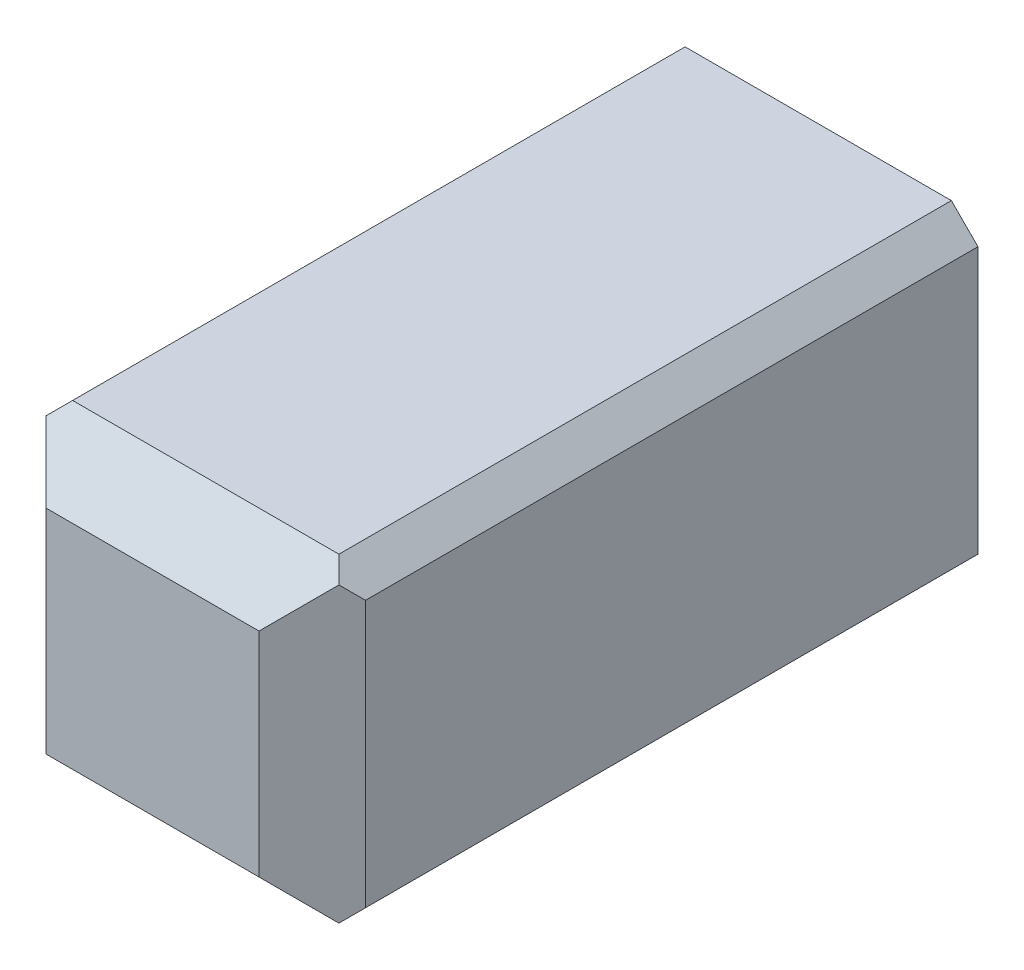
ISO-10303-21;
HEADER;
FILE_DESCRIPTION(('STEP AP214'),'2;1');
FILE_NAME('part.step','',(''),(''),'','','');
FILE_SCHEMA(('AUTOMOTIVE_DESIGN { 1 0 10303 214 1 1 1 1 }'));
ENDSEC;
DATA;
#1=APPLICATION_CONTEXT('core data for automotive mechanical design processes');
#2=APPLICATION_PROTOCOL_DEFINITION('international standard','automotive_design',2000,#1);
#3=PRODUCT_CONTEXT('',#1,'mechanical');
#4=PRODUCT('Part','Part','',(#3));
#5=PRODUCT_RELATED_PRODUCT_CATEGORY('part','',(#4));
#6=PRODUCT_DEFINITION_FORMATION('','',#4);
#7=PRODUCT_DEFINITION_CONTEXT('part definition',#1,'design');
#8=PRODUCT_DEFINITION('design','',#6,#7);
#9=PRODUCT_DEFINITION_SHAPE('','',#8);
#10=(LENGTH_UNIT() NAMED_UNIT(*) SI_UNIT(.MILLI.,.METRE.));
#11=(NAMED_UNIT(*) PLANE_ANGLE_UNIT() SI_UNIT($,.RADIAN.));
#12=(NAMED_UNIT(*) SI_UNIT($,.STERADIAN.) SOLID_ANGLE_UNIT());
#13=UNCERTAINTY_MEASURE_WITH_UNIT(LENGTH_MEASURE(1.E-05),#10,'distance_accuracy_value','');
#14=(GEOMETRIC_REPRESENTATION_CONTEXT(3) GLOBAL_UNCERTAINTY_ASSIGNED_CONTEXT((#13)) GLOBAL_UNIT_ASSIGNED_CONTEXT((#10,
#11,#12)) REPRESENTATION_CONTEXT('',''));
#15=CARTESIAN_POINT('',(0.,0.,0.));
#16=DIRECTION('',(0.,0.,1.));
#17=DIRECTION('',(1.,0.,0.));
#18=AXIS2_PLACEMENT_3D('',#15,#16,#17);
#19=CARTESIAN_POINT('',(0.,0.,50.));
#20=DIRECTION('',(1.,0.,0.));
#21=DIRECTION('',(0.,0.,-1.));
#22=AXIS2_PLACEMENT_3D('',#19,#20,#21);
#23=PLANE('',#22);
#24=DIRECTION('',(0.,0.,1.));
#25=VECTOR('',#24,1.);
#26=CARTESIAN_POINT('',(0.,2.,50.));
#27=LINE('',#26,#25);
#28=CARTESIAN_POINT('',(0.,2.,0.));
#29=VERTEX_POINT('',#28);
#30=CARTESIAN_POINT('',(0.,2.,46.));
#31=VERTEX_POINT('',#30);
#32=EDGE_CURVE('E140',#29,#31,#27,.T.);
#33=ORIENTED_EDGE('',*,*,#32,.T.);
#34=DIRECTION('',(0.,1.,0.));
#35=VECTOR('',#34,1.);
#36=CARTESIAN_POINT('',(0.,0.,46.));
#37=LINE('',#36,#35);
#38=CARTESIAN_POINT('',(0.,22.,46.));
#39=VERTEX_POINT('',#38);
#40=EDGE_CURVE('E11',#31,#39,#37,.T.);
#41=ORIENTED_EDGE('',*,*,#40,.T.);
#42=DIRECTION('',(0.,0.,-1.));
#43=VECTOR('',#42,1.);
#44=CARTESIAN_POINT('',(0.,22.,50.));
#45=LINE('',#44,#43);
#46=CARTESIAN_POINT('',(0.,22.,0.));
#47=VERTEX_POINT('',#46);
#48=EDGE_CURVE('E144',#39,#47,#45,.T.);
#49=ORIENTED_EDGE('',*,*,#48,.T.);
#50=DIRECTION('',(0.,-1.,0.));
#51=VECTOR('',#50,1.);
#52=CARTESIAN_POINT('',(0.,0.,0.));
#53=LINE('',#52,#51);
#54=EDGE_CURVE('E151',#47,#29,#53,.T.);
#55=ORIENTED_EDGE('',*,*,#54,.T.);
#56=EDGE_LOOP('',(#33,#41,#49,#55));
#57=FACE_BOUND('',#56,.T.);
#58=ADVANCED_FACE('F33',(#57),#23,.F.);
#59=CARTESIAN_POINT('',(0.,0.,50.));
#60=DIRECTION('',(0.,1.,0.));
#61=DIRECTION('',(0.,0.,1.));
#62=AXIS2_PLACEMENT_3D('',#59,#60,#61);
#63=PLANE('',#62);
#64=DIRECTION('',(0.,0.,1.));
#65=VECTOR('',#64,1.);
#66=CARTESIAN_POINT('',(22.,0.,50.));
#67=LINE('',#66,#65);
#68=CARTESIAN_POINT('',(22.,0.,0.));
#69=VERTEX_POINT('',#68);
#70=CARTESIAN_POINT('',(22.,0.,46.));
#71=VERTEX_POINT('',#70);
#72=EDGE_CURVE('E135',#69,#71,#67,.T.);
#73=ORIENTED_EDGE('',*,*,#72,.T.);
#74=DIRECTION('',(-1.,0.,0.));
#75=VECTOR('',#74,1.);
#76=CARTESIAN_POINT('',(0.,0.,46.));
#77=LINE('',#76,#75);
#78=CARTESIAN_POINT('',(1.99999999999999,0.,46.));
#79=VERTEX_POINT('',#78);
#80=EDGE_CURVE('E132',#71,#79,#77,.T.);
#81=ORIENTED_EDGE('',*,*,#80,.T.);
#82=DIRECTION('',(0.,0.,-1.));
#83=VECTOR('',#82,1.);
#84=CARTESIAN_POINT('',(1.99999999999999,0.,50.));
#85=LINE('',#84,#83);
#86=CARTESIAN_POINT('',(1.99999999999999,0.,0.));
#87=VERTEX_POINT('',#86);
#88=EDGE_CURVE('E124',#79,#87,#85,.T.);
#89=ORIENTED_EDGE('',*,*,#88,.T.);
#90=DIRECTION('',(1.,0.,0.));
#91=VECTOR('',#90,1.);
#92=CARTESIAN_POINT('',(0.,0.,0.));
#93=LINE('',#92,#91);
#94=EDGE_CURVE('E129',#87,#69,#93,.T.);
#95=ORIENTED_EDGE('',*,*,#94,.T.);
#96=EDGE_LOOP('',(#73,#81,#89,#95));
#97=FACE_BOUND('',#96,.T.);
#98=ADVANCED_FACE('F127',(#97),#63,.F.);
#99=CARTESIAN_POINT('',(24.,0.,50.));
#100=DIRECTION('',(-1.,0.,0.));
#101=DIRECTION('',(0.,0.,1.));
#102=AXIS2_PLACEMENT_3D('',#99,#100,#101);
#103=PLANE('',#102);
#104=DIRECTION('',(0.,0.,1.));
#105=VECTOR('',#104,1.);
#106=CARTESIAN_POINT('',(24.,22.,50.));
#107=LINE('',#106,#105);
#108=CARTESIAN_POINT('',(24.,22.,0.));
#109=VERTEX_POINT('',#108);
#110=CARTESIAN_POINT('',(24.,22.,46.));
#111=VERTEX_POINT('',#110);
#112=EDGE_CURVE('E176',#109,#111,#107,.T.);
#113=ORIENTED_EDGE('',*,*,#112,.T.);
#114=DIRECTION('',(0.,-1.,0.));
#115=VECTOR('',#114,1.);
#116=CARTESIAN_POINT('',(24.,0.,46.));
#117=LINE('',#116,#115);
#118=CARTESIAN_POINT('',(24.,1.99999999999999,46.));
#119=VERTEX_POINT('',#118);
#120=EDGE_CURVE('E201',#111,#119,#117,.T.);
#121=ORIENTED_EDGE('',*,*,#120,.T.);
#122=DIRECTION('',(0.,0.,-1.));
#123=VECTOR('',#122,1.);
#124=CARTESIAN_POINT('',(24.,1.99999999999999,50.));
#125=LINE('',#124,#123);
#126=CARTESIAN_POINT('',(24.,1.99999999999999,0.));
#127=VERTEX_POINT('',#126);
#128=EDGE_CURVE('E174',#119,#127,#125,.T.);
#129=ORIENTED_EDGE('',*,*,#128,.T.);
#130=DIRECTION('',(0.,1.,0.));
#131=VECTOR('',#130,1.);
#132=CARTESIAN_POINT('',(24.,0.,0.));
#133=LINE('',#132,#131);
#134=EDGE_CURVE('E150',#127,#109,#133,.T.);
#135=ORIENTED_EDGE('',*,*,#134,.T.);
#136=EDGE_LOOP('',(#113,#121,#129,#135));
#137=FACE_BOUND('',#136,.T.);
#138=ADVANCED_FACE('F281',(#137),#103,.F.);
#139=CARTESIAN_POINT('',(0.,24.,50.));
#140=DIRECTION('',(0.,-1.,0.));
#141=DIRECTION('',(0.,0.,-1.));
#142=AXIS2_PLACEMENT_3D('',#139,#140,#141);
#143=PLANE('',#142);
#144=DIRECTION('',(0.,0.,1.));
#145=VECTOR('',#144,1.);
#146=CARTESIAN_POINT('',(1.99999999999999,24.,50.));
#147=LINE('',#146,#145);
#148=CARTESIAN_POINT('',(1.99999999999999,24.,0.));
#149=VERTEX_POINT('',#148);
#150=CARTESIAN_POINT('',(1.99999999999999,24.,46.));
#151=VERTEX_POINT('',#150);
#152=EDGE_CURVE('E171',#149,#151,#147,.T.);
#153=ORIENTED_EDGE('',*,*,#152,.T.);
#154=DIRECTION('',(1.,0.,0.));
#155=VECTOR('',#154,1.);
#156=CARTESIAN_POINT('',(0.,24.,46.));
#157=LINE('',#156,#155);
#158=CARTESIAN_POINT('',(22.,24.,46.));
#159=VERTEX_POINT('',#158);
#160=EDGE_CURVE('E42',#151,#159,#157,.T.);
#161=ORIENTED_EDGE('',*,*,#160,.T.);
#162=DIRECTION('',(0.,0.,-1.));
#163=VECTOR('',#162,1.);
#164=CARTESIAN_POINT('',(22.,24.,50.));
#165=LINE('',#164,#163);
#166=CARTESIAN_POINT('',(22.,24.,0.));
#167=VERTEX_POINT('',#166);
#168=EDGE_CURVE('E169',#159,#167,#165,.T.);
#169=ORIENTED_EDGE('',*,*,#168,.T.);
#170=DIRECTION('',(-1.,0.,0.));
#171=VECTOR('',#170,1.);
#172=CARTESIAN_POINT('',(0.,24.,0.));
#173=LINE('',#172,#171);
#174=EDGE_CURVE('E154',#167,#149,#173,.T.);
#175=ORIENTED_EDGE('',*,*,#174,.T.);
#176=EDGE_LOOP('',(#153,#161,#169,#175));
#177=FACE_BOUND('',#176,.T.);
#178=ADVANCED_FACE('F323',(#177),#143,.F.);
#179=CARTESIAN_POINT('',(0.,0.,50.));
#180=DIRECTION('',(0.,0.,-1.));
#181=DIRECTION('',(-1.,0.,0.));
#182=AXIS2_PLACEMENT_3D('',#179,#180,#181);
#183=PLANE('',#182);
#184=DIRECTION('',(0.,-1.,0.));
#185=VECTOR('',#184,1.);
#186=CARTESIAN_POINT('',(4.,0.,50.));
#187=LINE('',#186,#185);
#188=CARTESIAN_POINT('',(4.,20.,50.));
#189=VERTEX_POINT('',#188);
#190=CARTESIAN_POINT('',(4.,4.,50.));
#191=VERTEX_POINT('',#190);
#192=EDGE_CURVE('E179',#189,#191,#187,.T.);
#193=ORIENTED_EDGE('',*,*,#192,.T.);
#194=DIRECTION('',(1.,0.,0.));
#195=VECTOR('',#194,1.);
#196=CARTESIAN_POINT('',(0.,4.,50.));
#197=LINE('',#196,#195);
#198=CARTESIAN_POINT('',(20.,4.,50.));
#199=VERTEX_POINT('',#198);
#200=EDGE_CURVE('E185',#191,#199,#197,.T.);
#201=ORIENTED_EDGE('',*,*,#200,.T.);
#202=DIRECTION('',(0.,1.,0.));
#203=VECTOR('',#202,1.);
#204=CARTESIAN_POINT('',(20.,0.,50.));
#205=LINE('',#204,#203);
#206=CARTESIAN_POINT('',(20.,20.,50.));
#207=VERTEX_POINT('',#206);
#208=EDGE_CURVE('E183',#199,#207,#205,.T.);
#209=ORIENTED_EDGE('',*,*,#208,.T.);
#210=DIRECTION('',(-1.,0.,0.));
#211=VECTOR('',#210,1.);
#212=CARTESIAN_POINT('',(0.,20.,50.));
#213=LINE('',#212,#211);
#214=EDGE_CURVE('E181',#207,#189,#213,.T.);
#215=ORIENTED_EDGE('',*,*,#214,.T.);
#216=EDGE_LOOP('',(#193,#201,#209,#215));
#217=FACE_BOUND('',#216,.T.);
#218=ADVANCED_FACE('F256',(#217),#183,.F.);
#219=CARTESIAN_POINT('',(0.,0.,0.));
#220=DIRECTION('',(0.,0.,-1.));
#221=DIRECTION('',(-1.,0.,0.));
#222=AXIS2_PLACEMENT_3D('',#219,#220,#221);
#223=PLANE('',#222);
#224=CARTESIAN_POINT('',(3.,21.,0.));
#225=DIRECTION('',(0.,0.,-1.));
#226=DIRECTION('',(-1.,0.,0.));
#227=AXIS2_PLACEMENT_3D('',#224,#225,#226);
#228=CIRCLE('',#227,1.4);
#229=CARTESIAN_POINT('',(1.6,21.,0.));
#230=VERTEX_POINT('',#229);
#231=EDGE_CURVE('E218',#230,#230,#228,.T.);
#232=ORIENTED_EDGE('',*,*,#231,.F.);
#233=EDGE_LOOP('',(#232));
#234=FACE_BOUND('',#233,.T.);
#235=CARTESIAN_POINT('',(3.,3.,0.));
#236=DIRECTION('',(0.,0.,-1.));
#237=DIRECTION('',(-1.,0.,0.));
#238=AXIS2_PLACEMENT_3D('',#235,#236,#237);
#239=CIRCLE('',#238,1.4);
#240=CARTESIAN_POINT('',(1.6,3.,0.));
#241=VERTEX_POINT('',#240);
#242=EDGE_CURVE('E228',#241,#241,#239,.T.);
#243=ORIENTED_EDGE('',*,*,#242,.F.);
#244=EDGE_LOOP('',(#243));
#245=FACE_BOUND('',#244,.T.);
#246=CARTESIAN_POINT('',(21.,3.,0.));
#247=DIRECTION('',(0.,0.,-1.));
#248=DIRECTION('',(-1.,0.,0.));
#249=AXIS2_PLACEMENT_3D('',#246,#247,#248);
#250=CIRCLE('',#249,1.4);
#251=CARTESIAN_POINT('',(19.6,3.,0.));
#252=VERTEX_POINT('',#251);
#253=EDGE_CURVE('E239',#252,#252,#250,.T.);
#254=ORIENTED_EDGE('',*,*,#253,.F.);
#255=EDGE_LOOP('',(#254));
#256=FACE_BOUND('',#255,.T.);
#257=CARTESIAN_POINT('',(21.,21.,0.));
#258=DIRECTION('',(0.,0.,-1.));
#259=DIRECTION('',(-1.,0.,0.));
#260=AXIS2_PLACEMENT_3D('',#257,#258,#259);
#261=CIRCLE('',#260,1.4);
#262=CARTESIAN_POINT('',(19.6,21.,0.));
#263=VERTEX_POINT('',#262);
#264=EDGE_CURVE('E233',#263,#263,#261,.T.);
#265=ORIENTED_EDGE('',*,*,#264,.F.);
#266=EDGE_LOOP('',(#265));
#267=FACE_BOUND('',#266,.T.);
#268=ORIENTED_EDGE('',*,*,#94,.F.);
#269=DIRECTION('',(0.707106781186546,-0.707106781186549,0.));
#270=VECTOR('',#269,1.);
#271=CARTESIAN_POINT('',(1.,0.999999999999997,0.));
#272=LINE('',#271,#270);
#273=EDGE_CURVE('E138',#87,#29,#272,.F.);
#274=ORIENTED_EDGE('',*,*,#273,.T.);
#275=ORIENTED_EDGE('',*,*,#54,.F.);
#276=DIRECTION('',(-0.707106781186549,-0.707106781186546,0.));
#277=VECTOR('',#276,1.);
#278=CARTESIAN_POINT('',(-11.,11.,0.));
#279=LINE('',#278,#277);
#280=EDGE_CURVE('E145',#47,#149,#279,.F.);
#281=ORIENTED_EDGE('',*,*,#280,.T.);
#282=ORIENTED_EDGE('',*,*,#174,.F.);
#283=DIRECTION('',(-0.707106781186546,0.707106781186549,0.));
#284=VECTOR('',#283,1.);
#285=CARTESIAN_POINT('',(23.,23.,0.));
#286=LINE('',#285,#284);
#287=EDGE_CURVE('E164',#167,#109,#286,.F.);
#288=ORIENTED_EDGE('',*,*,#287,.T.);
#289=ORIENTED_EDGE('',*,*,#134,.F.);
#290=DIRECTION('',(0.707106781186549,0.707106781186546,0.));
#291=VECTOR('',#290,1.);
#292=CARTESIAN_POINT('',(11.,-11.,0.));
#293=LINE('',#292,#291);
#294=EDGE_CURVE('E134',#127,#69,#293,.F.);
#295=ORIENTED_EDGE('',*,*,#294,.T.);
#296=EDGE_LOOP('',(#268,#274,#275,#281,#282,#288,#289,#295));
#297=FACE_BOUND('',#296,.T.);
#298=ADVANCED_FACE('F147',(#234,#245,#256,#267,#297),#223,.T.);
#299=CARTESIAN_POINT('',(21.,21.,8.));
#300=DIRECTION('',(0.,0.,-1.));
#301=DIRECTION('',(-1.,0.,0.));
#302=AXIS2_PLACEMENT_3D('',#299,#300,#301);
#303=CYLINDRICAL_SURFACE('',#302,1.4);
#304=CARTESIAN_POINT('',(21.,21.,8.));
#305=DIRECTION('',(0.,0.,-1.));
#306=DIRECTION('',(-1.,0.,0.));
#307=AXIS2_PLACEMENT_3D('',#304,#305,#306);
#308=CIRCLE('',#307,1.4);
#309=CARTESIAN_POINT('',(19.6,21.,8.));
#310=VERTEX_POINT('',#309);
#311=EDGE_CURVE('E156',#310,#310,#308,.T.);
#312=ORIENTED_EDGE('',*,*,#311,.F.);
#313=EDGE_LOOP('',(#312));
#314=FACE_BOUND('',#313,.T.);
#315=ORIENTED_EDGE('',*,*,#264,.T.);
#316=EDGE_LOOP('',(#315));
#317=FACE_BOUND('',#316,.T.);
#318=ADVANCED_FACE('F255',(#314,#317),#303,.F.);
#319=CARTESIAN_POINT('',(21.,21.,8.));
#320=DIRECTION('',(0.,0.,-1.));
#321=DIRECTION('',(-1.,0.,0.));
#322=AXIS2_PLACEMENT_3D('',#319,#320,#321);
#323=PLANE('',#322);
#324=ORIENTED_EDGE('',*,*,#311,.T.);
#325=EDGE_LOOP('',(#324));
#326=FACE_BOUND('',#325,.T.);
#327=ADVANCED_FACE('F265',(#326),#323,.T.);
#328=CARTESIAN_POINT('',(21.,3.,8.));
#329=DIRECTION('',(0.,0.,-1.));
#330=DIRECTION('',(-1.,0.,0.));
#331=AXIS2_PLACEMENT_3D('',#328,#329,#330);
#332=CYLINDRICAL_SURFACE('',#331,1.4);
#333=CARTESIAN_POINT('',(21.,3.,8.));
#334=DIRECTION('',(0.,0.,-1.));
#335=DIRECTION('',(-1.,0.,0.));
#336=AXIS2_PLACEMENT_3D('',#333,#334,#335);
#337=CIRCLE('',#336,1.4);
#338=CARTESIAN_POINT('',(19.6,3.,8.));
#339=VERTEX_POINT('',#338);
#340=EDGE_CURVE('E235',#339,#339,#337,.T.);
#341=ORIENTED_EDGE('',*,*,#340,.F.);
#342=EDGE_LOOP('',(#341));
#343=FACE_BOUND('',#342,.T.);
#344=ORIENTED_EDGE('',*,*,#253,.T.);
#345=EDGE_LOOP('',(#344));
#346=FACE_BOUND('',#345,.T.);
#347=ADVANCED_FACE('F262',(#343,#346),#332,.F.);
#348=CARTESIAN_POINT('',(21.,3.,8.));
#349=DIRECTION('',(0.,0.,-1.));
#350=DIRECTION('',(-1.,0.,0.));
#351=AXIS2_PLACEMENT_3D('',#348,#349,#350);
#352=PLANE('',#351);
#353=ORIENTED_EDGE('',*,*,#340,.T.);
#354=EDGE_LOOP('',(#353));
#355=FACE_BOUND('',#354,.T.);
#356=ADVANCED_FACE('F264',(#355),#352,.T.);
#357=CARTESIAN_POINT('',(3.,3.,8.));
#358=DIRECTION('',(0.,0.,-1.));
#359=DIRECTION('',(-1.,0.,0.));
#360=AXIS2_PLACEMENT_3D('',#357,#358,#359);
#361=CYLINDRICAL_SURFACE('',#360,1.4);
#362=CARTESIAN_POINT('',(3.,3.,8.));
#363=DIRECTION('',(0.,0.,-1.));
#364=DIRECTION('',(-1.,0.,0.));
#365=AXIS2_PLACEMENT_3D('',#362,#363,#364);
#366=CIRCLE('',#365,1.4);
#367=CARTESIAN_POINT('',(1.6,3.,8.));
#368=VERTEX_POINT('',#367);
#369=EDGE_CURVE('E244',#368,#368,#366,.T.);
#370=ORIENTED_EDGE('',*,*,#369,.F.);
#371=EDGE_LOOP('',(#370));
#372=FACE_BOUND('',#371,.T.);
#373=ORIENTED_EDGE('',*,*,#242,.T.);
#374=EDGE_LOOP('',(#373));
#375=FACE_BOUND('',#374,.T.);
#376=ADVANCED_FACE('F251',(#372,#375),#361,.F.);
#377=CARTESIAN_POINT('',(3.,3.,8.));
#378=DIRECTION('',(0.,0.,-1.));
#379=DIRECTION('',(-1.,0.,0.));
#380=AXIS2_PLACEMENT_3D('',#377,#378,#379);
#381=PLANE('',#380);
#382=ORIENTED_EDGE('',*,*,#369,.T.);
#383=EDGE_LOOP('',(#382));
#384=FACE_BOUND('',#383,.T.);
#385=ADVANCED_FACE('F346',(#384),#381,.T.);
#386=CARTESIAN_POINT('',(3.,21.,8.));
#387=DIRECTION('',(0.,0.,-1.));
#388=DIRECTION('',(-1.,0.,0.));
#389=AXIS2_PLACEMENT_3D('',#386,#387,#388);
#390=CYLINDRICAL_SURFACE('',#389,1.4);
#391=CARTESIAN_POINT('',(3.,21.,8.));
#392=DIRECTION('',(0.,0.,-1.));
#393=DIRECTION('',(-1.,0.,0.));
#394=AXIS2_PLACEMENT_3D('',#391,#392,#393);
#395=CIRCLE('',#394,1.4);
#396=CARTESIAN_POINT('',(1.6,21.,8.));
#397=VERTEX_POINT('',#396);
#398=EDGE_CURVE('E223',#397,#397,#395,.T.);
#399=ORIENTED_EDGE('',*,*,#398,.F.);
#400=EDGE_LOOP('',(#399));
#401=FACE_BOUND('',#400,.T.);
#402=ORIENTED_EDGE('',*,*,#231,.T.);
#403=EDGE_LOOP('',(#402));
#404=FACE_BOUND('',#403,.T.);
#405=ADVANCED_FACE('F343',(#401,#404),#390,.F.);
#406=CARTESIAN_POINT('',(3.,21.,8.));
#407=DIRECTION('',(0.,0.,-1.));
#408=DIRECTION('',(-1.,0.,0.));
#409=AXIS2_PLACEMENT_3D('',#406,#407,#408);
#410=PLANE('',#409);
#411=ORIENTED_EDGE('',*,*,#398,.T.);
#412=EDGE_LOOP('',(#411));
#413=FACE_BOUND('',#412,.T.);
#414=ADVANCED_FACE('F288',(#413),#410,.T.);
#415=CARTESIAN_POINT('',(1.99999999999999,0.,50.));
#416=DIRECTION('',(0.707106781186549,0.707106781186546,0.));
#417=DIRECTION('',(0.,0.,-1.));
#418=AXIS2_PLACEMENT_3D('',#415,#416,#417);
#419=PLANE('',#418);
#420=ORIENTED_EDGE('',*,*,#88,.F.);
#421=DIRECTION('',(-0.577350269189624,0.577350269189626,0.577350269189628));
#422=VECTOR('',#421,1.);
#423=CARTESIAN_POINT('',(0.666666666666656,1.33333333333334,47.3333333333333));
#424=LINE('',#423,#422);
#425=CARTESIAN_POINT('',(0.999999999999997,1.,47.));
#426=VERTEX_POINT('',#425);
#427=EDGE_CURVE('E195',#79,#426,#424,.T.);
#428=ORIENTED_EDGE('',*,*,#427,.T.);
#429=DIRECTION('',(-0.577350269189624,0.577350269189627,-0.577350269189626));
#430=VECTOR('',#429,1.);
#431=CARTESIAN_POINT('',(2.66666666666667,-0.666666666666673,48.6666666666667));
#432=LINE('',#431,#430);
#433=EDGE_CURVE('E193',#426,#31,#432,.T.);
#434=ORIENTED_EDGE('',*,*,#433,.T.);
#435=ORIENTED_EDGE('',*,*,#32,.F.);
#436=ORIENTED_EDGE('',*,*,#273,.F.);
#437=EDGE_LOOP('',(#420,#428,#434,#435,#436));
#438=FACE_BOUND('',#437,.T.);
#439=ADVANCED_FACE('F139',(#438),#419,.F.);
#440=CARTESIAN_POINT('',(0.,22.,50.));
#441=DIRECTION('',(0.707106781186546,-0.707106781186549,0.));
#442=DIRECTION('',(0.,0.,-1.));
#443=AXIS2_PLACEMENT_3D('',#440,#441,#442);
#444=PLANE('',#443);
#445=DIRECTION('',(0.577350269189626,0.577350269189624,0.577350269189628));
#446=VECTOR('',#445,1.);
#447=CARTESIAN_POINT('',(1.33333333333334,23.3333333333334,47.3333333333333));
#448=LINE('',#447,#446);
#449=CARTESIAN_POINT('',(0.999999999999998,23.,47.));
#450=VERTEX_POINT('',#449);
#451=EDGE_CURVE('E50',#39,#450,#448,.T.);
#452=ORIENTED_EDGE('',*,*,#451,.T.);
#453=DIRECTION('',(0.577350269189626,0.577350269189624,-0.577350269189626));
#454=VECTOR('',#453,1.);
#455=CARTESIAN_POINT('',(-0.666666666666676,21.3333333333333,48.6666666666667));
#456=LINE('',#455,#454);
#457=EDGE_CURVE('E204',#450,#151,#456,.T.);
#458=ORIENTED_EDGE('',*,*,#457,.T.);
#459=ORIENTED_EDGE('',*,*,#152,.F.);
#460=ORIENTED_EDGE('',*,*,#280,.F.);
#461=ORIENTED_EDGE('',*,*,#48,.F.);
#462=EDGE_LOOP('',(#452,#458,#459,#460,#461));
#463=FACE_BOUND('',#462,.T.);
#464=ADVANCED_FACE('F287',(#463),#444,.F.);
#465=CARTESIAN_POINT('',(22.,24.,50.));
#466=DIRECTION('',(-0.707106781186549,-0.707106781186546,0.));
#467=DIRECTION('',(0.,0.,-1.));
#468=AXIS2_PLACEMENT_3D('',#465,#466,#467);
#469=PLANE('',#468);
#470=DIRECTION('',(0.577350269189624,-0.577350269189626,0.577350269189628));
#471=VECTOR('',#470,1.);
#472=CARTESIAN_POINT('',(23.3333333333334,22.6666666666667,47.3333333333333));
#473=LINE('',#472,#471);
#474=CARTESIAN_POINT('',(23.,23.,47.));
#475=VERTEX_POINT('',#474);
#476=EDGE_CURVE('E197',#159,#475,#473,.T.);
#477=ORIENTED_EDGE('',*,*,#476,.T.);
#478=DIRECTION('',(0.577350269189624,-0.577350269189626,-0.577350269189626));
#479=VECTOR('',#478,1.);
#480=CARTESIAN_POINT('',(21.3333333333333,24.6666666666667,48.6666666666667));
#481=LINE('',#480,#479);
#482=EDGE_CURVE('E199',#475,#111,#481,.T.);
#483=ORIENTED_EDGE('',*,*,#482,.T.);
#484=ORIENTED_EDGE('',*,*,#112,.F.);
#485=ORIENTED_EDGE('',*,*,#287,.F.);
#486=ORIENTED_EDGE('',*,*,#168,.F.);
#487=EDGE_LOOP('',(#477,#483,#484,#485,#486));
#488=FACE_BOUND('',#487,.T.);
#489=ADVANCED_FACE('F291',(#488),#469,.F.);
#490=CARTESIAN_POINT('',(24.,1.99999999999999,50.));
#491=DIRECTION('',(-0.707106781186546,0.707106781186549,0.));
#492=DIRECTION('',(0.,0.,-1.));
#493=AXIS2_PLACEMENT_3D('',#490,#491,#492);
#494=PLANE('',#493);
#495=DIRECTION('',(-0.577350269189626,-0.577350269189624,0.577350269189628));
#496=VECTOR('',#495,1.);
#497=CARTESIAN_POINT('',(22.6666666666667,0.666666666666656,47.3333333333333));
#498=LINE('',#497,#496);
#499=CARTESIAN_POINT('',(23.,0.999999999999999,47.));
#500=VERTEX_POINT('',#499);
#501=EDGE_CURVE('E188',#119,#500,#498,.T.);
#502=ORIENTED_EDGE('',*,*,#501,.T.);
#503=DIRECTION('',(-0.577350269189627,-0.577350269189624,-0.577350269189626));
#504=VECTOR('',#503,1.);
#505=CARTESIAN_POINT('',(24.6666666666667,2.66666666666667,48.6666666666667));
#506=LINE('',#505,#504);
#507=EDGE_CURVE('E190',#500,#71,#506,.T.);
#508=ORIENTED_EDGE('',*,*,#507,.T.);
#509=ORIENTED_EDGE('',*,*,#72,.F.);
#510=ORIENTED_EDGE('',*,*,#294,.F.);
#511=ORIENTED_EDGE('',*,*,#128,.F.);
#512=EDGE_LOOP('',(#502,#508,#509,#510,#511));
#513=FACE_BOUND('',#512,.T.);
#514=ADVANCED_FACE('F294',(#513),#494,.F.);
#515=CARTESIAN_POINT('',(0.,20.,50.));
#516=DIRECTION('',(0.,-0.707106781186549,-0.707106781186546));
#517=DIRECTION('',(-1.,0.,0.));
#518=AXIS2_PLACEMENT_3D('',#515,#516,#517);
#519=PLANE('',#518);
#520=ORIENTED_EDGE('',*,*,#160,.F.);
#521=ORIENTED_EDGE('',*,*,#457,.F.);
#522=DIRECTION('',(-0.577350269189625,0.577350269189625,-0.577350269189627));
#523=VECTOR('',#522,1.);
#524=CARTESIAN_POINT('',(10.6666666666667,13.3333333333333,56.6666666666667));
#525=LINE('',#524,#523);
#526=EDGE_CURVE('E37',#189,#450,#525,.T.);
#527=ORIENTED_EDGE('',*,*,#526,.F.);
#528=ORIENTED_EDGE('',*,*,#214,.F.);
#529=DIRECTION('',(0.577350269189625,0.577350269189625,-0.577350269189627));
#530=VECTOR('',#529,1.);
#531=CARTESIAN_POINT('',(13.3333333333333,13.3333333333333,56.6666666666667));
#532=LINE('',#531,#530);
#533=EDGE_CURVE('E211',#475,#207,#532,.F.);
#534=ORIENTED_EDGE('',*,*,#533,.F.);
#535=ORIENTED_EDGE('',*,*,#476,.F.);
#536=EDGE_LOOP('',(#520,#521,#527,#528,#534,#535));
#537=FACE_BOUND('',#536,.T.);
#538=ADVANCED_FACE('F35',(#537),#519,.F.);
#539=CARTESIAN_POINT('',(4.,0.,50.));
#540=DIRECTION('',(0.707106781186549,0.,-0.707106781186546));
#541=DIRECTION('',(0.,-1.,0.));
#542=AXIS2_PLACEMENT_3D('',#539,#540,#541);
#543=PLANE('',#542);
#544=ORIENTED_EDGE('',*,*,#40,.F.);
#545=ORIENTED_EDGE('',*,*,#433,.F.);
#546=DIRECTION('',(-0.577350269189625,-0.577350269189625,-0.577350269189627));
#547=VECTOR('',#546,1.);
#548=CARTESIAN_POINT('',(2.66666666666667,2.66666666666667,48.6666666666667));
#549=LINE('',#548,#547);
#550=EDGE_CURVE('E209',#191,#426,#549,.T.);
#551=ORIENTED_EDGE('',*,*,#550,.F.);
#552=ORIENTED_EDGE('',*,*,#192,.F.);
#553=ORIENTED_EDGE('',*,*,#526,.T.);
#554=ORIENTED_EDGE('',*,*,#451,.F.);
#555=EDGE_LOOP('',(#544,#545,#551,#552,#553,#554));
#556=FACE_BOUND('',#555,.T.);
#557=ADVANCED_FACE('F305',(#556),#543,.F.);
#558=CARTESIAN_POINT('',(20.,0.,50.));
#559=DIRECTION('',(-0.707106781186549,0.,-0.707106781186546));
#560=DIRECTION('',(0.,1.,0.));
#561=AXIS2_PLACEMENT_3D('',#558,#559,#560);
#562=PLANE('',#561);
#563=ORIENTED_EDGE('',*,*,#533,.T.);
#564=ORIENTED_EDGE('',*,*,#208,.F.);
#565=DIRECTION('',(0.577350269189625,-0.577350269189625,-0.577350269189627));
#566=VECTOR('',#565,1.);
#567=CARTESIAN_POINT('',(21.3333333333333,2.66666666666667,48.6666666666667));
#568=LINE('',#567,#566);
#569=EDGE_CURVE('E207',#500,#199,#568,.F.);
#570=ORIENTED_EDGE('',*,*,#569,.F.);
#571=ORIENTED_EDGE('',*,*,#501,.F.);
#572=ORIENTED_EDGE('',*,*,#120,.F.);
#573=ORIENTED_EDGE('',*,*,#482,.F.);
#574=EDGE_LOOP('',(#563,#564,#570,#571,#572,#573));
#575=FACE_BOUND('',#574,.T.);
#576=ADVANCED_FACE('F302',(#575),#562,.F.);
#577=CARTESIAN_POINT('',(0.,4.,50.));
#578=DIRECTION('',(0.,0.707106781186549,-0.707106781186546));
#579=DIRECTION('',(1.,0.,0.));
#580=AXIS2_PLACEMENT_3D('',#577,#578,#579);
#581=PLANE('',#580);
#582=ORIENTED_EDGE('',*,*,#427,.F.);
#583=ORIENTED_EDGE('',*,*,#80,.F.);
#584=ORIENTED_EDGE('',*,*,#507,.F.);
#585=ORIENTED_EDGE('',*,*,#569,.T.);
#586=ORIENTED_EDGE('',*,*,#200,.F.);
#587=ORIENTED_EDGE('',*,*,#550,.T.);
#588=EDGE_LOOP('',(#582,#583,#584,#585,#586,#587));
#589=FACE_BOUND('',#588,.T.);
#590=ADVANCED_FACE('F299',(#589),#581,.F.);
#591=CLOSED_SHELL('',(#58,#98,#138,#178,#218,#298,#318,#327,#347,#356,#376,#385,#405,#414,#439,
#464,#489,#514,#538,#557,#576,#590));
#592=MANIFOLD_SOLID_BREP('B2',#591);
#593=ADVANCED_BREP_SHAPE_REPRESENTATION('',(#18,#592),#14);
#594=SHAPE_DEFINITION_REPRESENTATION(#9,#593);
ENDSEC;
END-ISO-10303-21;
